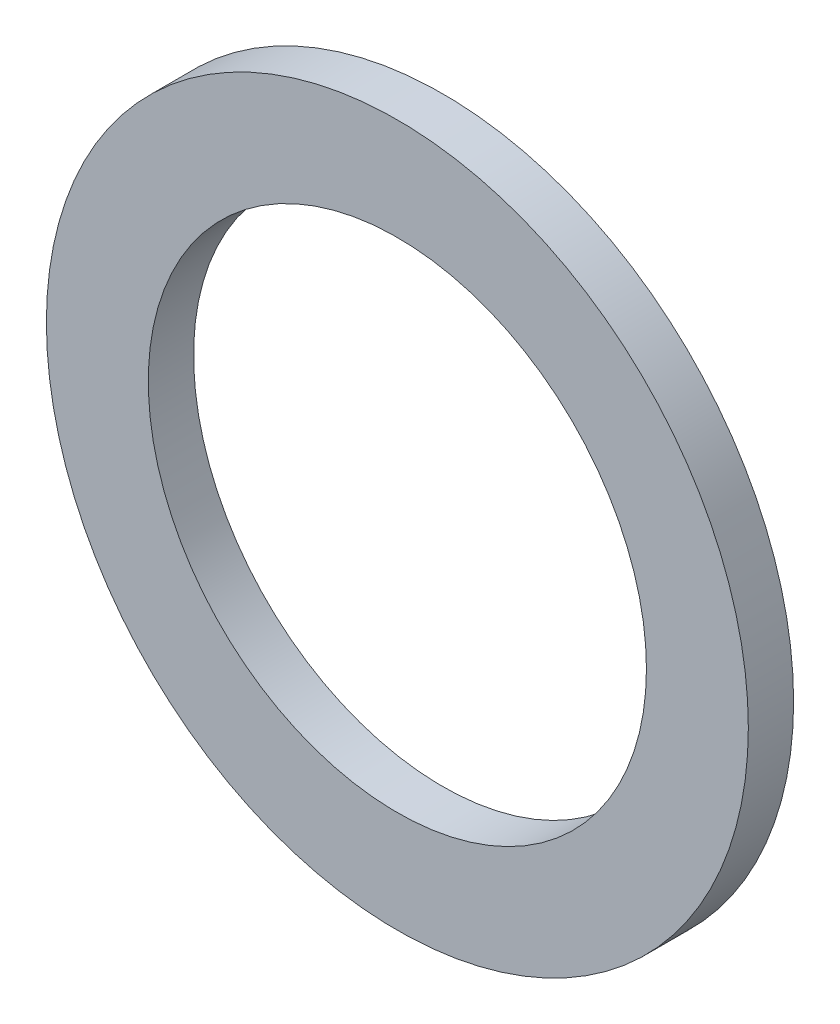
ISO-10303-21;
HEADER;
FILE_DESCRIPTION(('STEP AP214'),'2;1');
FILE_NAME('part.step','',(''),(''),'','','');
FILE_SCHEMA(('AUTOMOTIVE_DESIGN { 1 0 10303 214 1 1 1 1 }'));
ENDSEC;
DATA;
#1=APPLICATION_CONTEXT('core data for automotive mechanical design processes');
#2=APPLICATION_PROTOCOL_DEFINITION('international standard','automotive_design',2000,#1);
#3=PRODUCT_CONTEXT('',#1,'mechanical');
#4=PRODUCT('Part','Part','',(#3));
#5=PRODUCT_RELATED_PRODUCT_CATEGORY('part','',(#4));
#6=PRODUCT_DEFINITION_FORMATION('','',#4);
#7=PRODUCT_DEFINITION_CONTEXT('part definition',#1,'design');
#8=PRODUCT_DEFINITION('design','',#6,#7);
#9=PRODUCT_DEFINITION_SHAPE('','',#8);
#10=(LENGTH_UNIT() NAMED_UNIT(*) SI_UNIT(.MILLI.,.METRE.));
#11=(NAMED_UNIT(*) PLANE_ANGLE_UNIT() SI_UNIT($,.RADIAN.));
#12=(NAMED_UNIT(*) SI_UNIT($,.STERADIAN.) SOLID_ANGLE_UNIT());
#13=UNCERTAINTY_MEASURE_WITH_UNIT(LENGTH_MEASURE(1.E-05),#10,'distance_accuracy_value','');
#14=(GEOMETRIC_REPRESENTATION_CONTEXT(3) GLOBAL_UNCERTAINTY_ASSIGNED_CONTEXT((#13)) GLOBAL_UNIT_ASSIGNED_CONTEXT((#10,
#11,#12)) REPRESENTATION_CONTEXT('',''));
#15=CARTESIAN_POINT('',(0.,0.,0.));
#16=DIRECTION('',(0.,0.,1.));
#17=DIRECTION('',(1.,0.,0.));
#18=AXIS2_PLACEMENT_3D('',#15,#16,#17);
#19=CARTESIAN_POINT('',(0.,0.,1.5875));
#20=DIRECTION('',(0.,0.,1.));
#21=DIRECTION('',(1.,0.,0.));
#22=AXIS2_PLACEMENT_3D('',#19,#20,#21);
#23=PLANE('',#22);
#24=CARTESIAN_POINT('',(0.,0.,1.5875));
#25=DIRECTION('',(0.,0.,1.));
#26=DIRECTION('',(1.,0.,0.));
#27=AXIS2_PLACEMENT_3D('',#24,#25,#26);
#28=CIRCLE('',#27,24.60625);
#29=CARTESIAN_POINT('',(24.60625,0.,1.5875));
#30=VERTEX_POINT('',#29);
#31=EDGE_CURVE('E10',#30,#30,#28,.T.);
#32=ORIENTED_EDGE('',*,*,#31,.T.);
#33=EDGE_LOOP('',(#32));
#34=FACE_BOUND('',#33,.T.);
#35=CARTESIAN_POINT('',(0.,0.,1.5875));
#36=DIRECTION('',(0.,0.,1.));
#37=DIRECTION('',(1.,0.,0.));
#38=AXIS2_PLACEMENT_3D('',#35,#36,#37);
#39=CIRCLE('',#38,17.4625);
#40=CARTESIAN_POINT('',(17.4625,0.,1.5875));
#41=VERTEX_POINT('',#40);
#42=EDGE_CURVE('E43',#41,#41,#39,.T.);
#43=ORIENTED_EDGE('',*,*,#42,.F.);
#44=EDGE_LOOP('',(#43));
#45=FACE_BOUND('',#44,.T.);
#46=ADVANCED_FACE('F32',(#34,#45),#23,.T.);
#47=CARTESIAN_POINT('',(0.,0.,-1.5875));
#48=DIRECTION('',(0.,0.,1.));
#49=DIRECTION('',(1.,0.,0.));
#50=AXIS2_PLACEMENT_3D('',#47,#48,#49);
#51=PLANE('',#50);
#52=CARTESIAN_POINT('',(0.,0.,-1.5875));
#53=DIRECTION('',(0.,0.,1.));
#54=DIRECTION('',(1.,0.,0.));
#55=AXIS2_PLACEMENT_3D('',#52,#53,#54);
#56=CIRCLE('',#55,24.60625);
#57=CARTESIAN_POINT('',(24.60625,0.,-1.5875));
#58=VERTEX_POINT('',#57);
#59=EDGE_CURVE('E36',#58,#58,#56,.T.);
#60=ORIENTED_EDGE('',*,*,#59,.F.);
#61=EDGE_LOOP('',(#60));
#62=FACE_BOUND('',#61,.T.);
#63=CARTESIAN_POINT('',(0.,0.,-1.5875));
#64=DIRECTION('',(0.,0.,1.));
#65=DIRECTION('',(1.,0.,0.));
#66=AXIS2_PLACEMENT_3D('',#63,#64,#65);
#67=CIRCLE('',#66,17.4625);
#68=CARTESIAN_POINT('',(17.4625,0.,-1.5875));
#69=VERTEX_POINT('',#68);
#70=EDGE_CURVE('E45',#69,#69,#67,.T.);
#71=ORIENTED_EDGE('',*,*,#70,.T.);
#72=EDGE_LOOP('',(#71));
#73=FACE_BOUND('',#72,.T.);
#74=ADVANCED_FACE('F55',(#62,#73),#51,.F.);
#75=CARTESIAN_POINT('',(0.,0.,1.5875));
#76=DIRECTION('',(0.,0.,-1.));
#77=DIRECTION('',(-1.,0.,0.));
#78=AXIS2_PLACEMENT_3D('',#75,#76,#77);
#79=CYLINDRICAL_SURFACE('',#78,24.60625);
#80=ORIENTED_EDGE('',*,*,#31,.F.);
#81=EDGE_LOOP('',(#80));
#82=FACE_BOUND('',#81,.T.);
#83=ORIENTED_EDGE('',*,*,#59,.T.);
#84=EDGE_LOOP('',(#83));
#85=FACE_BOUND('',#84,.T.);
#86=ADVANCED_FACE('F34',(#82,#85),#79,.T.);
#87=CARTESIAN_POINT('',(0.,0.,1.5875));
#88=DIRECTION('',(0.,0.,-1.));
#89=DIRECTION('',(-1.,0.,0.));
#90=AXIS2_PLACEMENT_3D('',#87,#88,#89);
#91=CYLINDRICAL_SURFACE('',#90,17.4625);
#92=ORIENTED_EDGE('',*,*,#42,.T.);
#93=EDGE_LOOP('',(#92));
#94=FACE_BOUND('',#93,.T.);
#95=ORIENTED_EDGE('',*,*,#70,.F.);
#96=EDGE_LOOP('',(#95));
#97=FACE_BOUND('',#96,.T.);
#98=ADVANCED_FACE('F51',(#94,#97),#91,.F.);
#99=CLOSED_SHELL('',(#46,#74,#86,#98));
#100=MANIFOLD_SOLID_BREP('B2',#99);
#101=ADVANCED_BREP_SHAPE_REPRESENTATION('',(#18,#100),#14);
#102=SHAPE_DEFINITION_REPRESENTATION(#9,#101);
ENDSEC;
END-ISO-10303-21;
